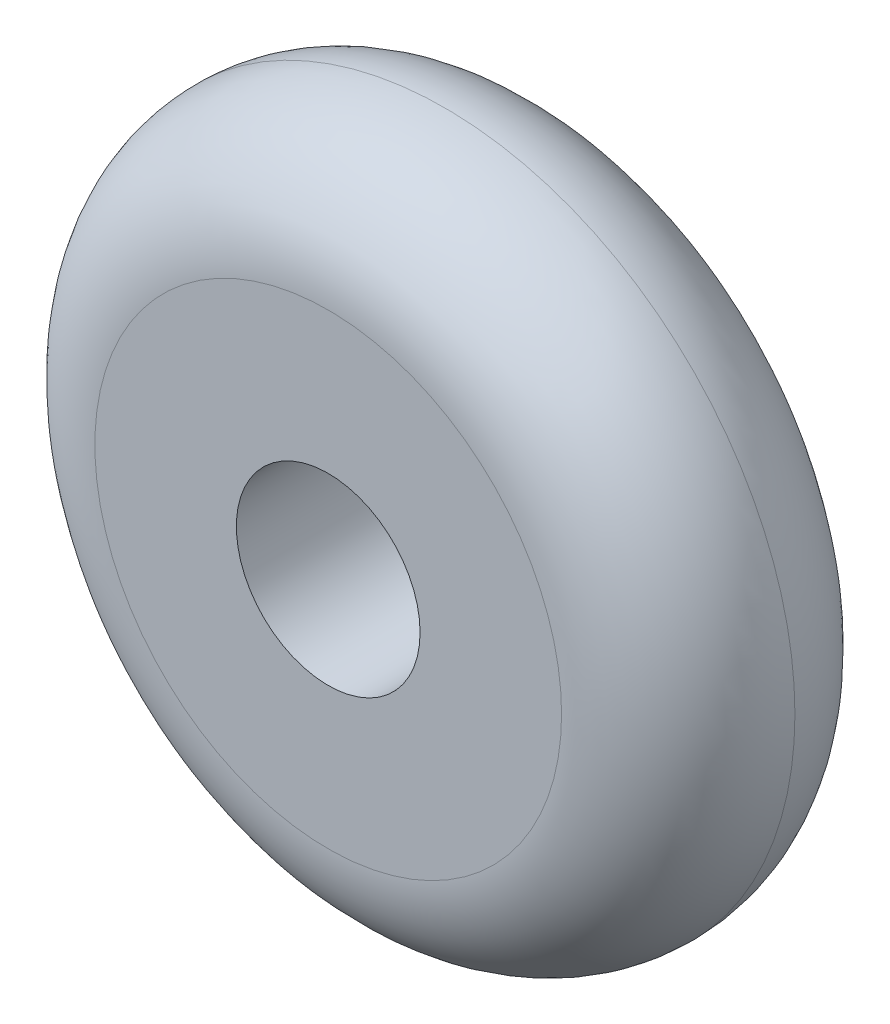
ISO-10303-21;
HEADER;
FILE_DESCRIPTION(('STEP AP214'),'2;1');
FILE_NAME('part.step','',(''),(''),'','','');
FILE_SCHEMA(('AUTOMOTIVE_DESIGN { 1 0 10303 214 1 1 1 1 }'));
ENDSEC;
DATA;
#1=APPLICATION_CONTEXT('core data for automotive mechanical design processes');
#2=APPLICATION_PROTOCOL_DEFINITION('international standard','automotive_design',2000,#1);
#3=PRODUCT_CONTEXT('',#1,'mechanical');
#4=PRODUCT('Part','Part','',(#3));
#5=PRODUCT_RELATED_PRODUCT_CATEGORY('part','',(#4));
#6=PRODUCT_DEFINITION_FORMATION('','',#4);
#7=PRODUCT_DEFINITION_CONTEXT('part definition',#1,'design');
#8=PRODUCT_DEFINITION('design','',#6,#7);
#9=PRODUCT_DEFINITION_SHAPE('','',#8);
#10=(LENGTH_UNIT() NAMED_UNIT(*) SI_UNIT(.MILLI.,.METRE.));
#11=(NAMED_UNIT(*) PLANE_ANGLE_UNIT() SI_UNIT($,.RADIAN.));
#12=(NAMED_UNIT(*) SI_UNIT($,.STERADIAN.) SOLID_ANGLE_UNIT());
#13=UNCERTAINTY_MEASURE_WITH_UNIT(LENGTH_MEASURE(1.E-05),#10,'distance_accuracy_value','');
#14=(GEOMETRIC_REPRESENTATION_CONTEXT(3) GLOBAL_UNCERTAINTY_ASSIGNED_CONTEXT((#13)) GLOBAL_UNIT_ASSIGNED_CONTEXT((#10,
#11,#12)) REPRESENTATION_CONTEXT('',''));
#15=CARTESIAN_POINT('',(0.,0.,0.));
#16=DIRECTION('',(0.,0.,1.));
#17=DIRECTION('',(1.,0.,0.));
#18=AXIS2_PLACEMENT_3D('',#15,#16,#17);
#19=CARTESIAN_POINT('',(0.,0.,12.7));
#20=DIRECTION('',(0.,0.,1.));
#21=DIRECTION('',(1.,0.,0.));
#22=AXIS2_PLACEMENT_3D('',#19,#20,#21);
#23=PLANE('',#22);
#24=CARTESIAN_POINT('',(0.,0.,12.7));
#25=DIRECTION('',(0.,0.,1.));
#26=DIRECTION('',(1.,0.,0.));
#27=AXIS2_PLACEMENT_3D('',#24,#25,#26);
#28=CIRCLE('',#27,9.999999939);
#29=CARTESIAN_POINT('',(9.999999939,0.,12.7));
#30=VERTEX_POINT('',#29);
#31=EDGE_CURVE('E44',#30,#30,#28,.T.);
#32=ORIENTED_EDGE('',*,*,#31,.F.);
#33=EDGE_LOOP('',(#32));
#34=FACE_BOUND('',#33,.T.);
#35=CARTESIAN_POINT('',(0.,0.,12.7));
#36=DIRECTION('',(0.,0.,1.));
#37=DIRECTION('',(1.,0.,0.));
#38=AXIS2_PLACEMENT_3D('',#35,#36,#37);
#39=CIRCLE('',#38,25.4);
#40=CARTESIAN_POINT('',(25.4,0.,12.7));
#41=VERTEX_POINT('',#40);
#42=EDGE_CURVE('E10',#41,#41,#39,.T.);
#43=ORIENTED_EDGE('',*,*,#42,.T.);
#44=EDGE_LOOP('',(#43));
#45=FACE_BOUND('',#44,.T.);
#46=ADVANCED_FACE('F30',(#34,#45),#23,.T.);
#47=CARTESIAN_POINT('',(0.,0.,-12.7));
#48=DIRECTION('',(0.,0.,1.));
#49=DIRECTION('',(1.,0.,0.));
#50=AXIS2_PLACEMENT_3D('',#47,#48,#49);
#51=PLANE('',#50);
#52=CARTESIAN_POINT('',(0.,0.,-12.7));
#53=DIRECTION('',(0.,0.,1.));
#54=DIRECTION('',(1.,0.,0.));
#55=AXIS2_PLACEMENT_3D('',#52,#53,#54);
#56=CIRCLE('',#55,9.999999939);
#57=CARTESIAN_POINT('',(9.999999939,0.,-12.7));
#58=VERTEX_POINT('',#57);
#59=EDGE_CURVE('E47',#58,#58,#56,.T.);
#60=ORIENTED_EDGE('',*,*,#59,.T.);
#61=EDGE_LOOP('',(#60));
#62=FACE_BOUND('',#61,.T.);
#63=CARTESIAN_POINT('',(0.,0.,-12.7));
#64=DIRECTION('',(0.,0.,1.));
#65=DIRECTION('',(1.,0.,0.));
#66=AXIS2_PLACEMENT_3D('',#63,#64,#65);
#67=CIRCLE('',#66,25.4);
#68=CARTESIAN_POINT('',(25.4,0.,-12.7));
#69=VERTEX_POINT('',#68);
#70=EDGE_CURVE('E38',#69,#69,#67,.F.);
#71=ORIENTED_EDGE('',*,*,#70,.T.);
#72=EDGE_LOOP('',(#71));
#73=FACE_BOUND('',#72,.T.);
#74=ADVANCED_FACE('F51',(#62,#73),#51,.F.);
#75=CARTESIAN_POINT('',(0.,0.,0.));
#76=DIRECTION('',(0.,0.,1.));
#77=DIRECTION('',(1.,0.,0.));
#78=AXIS2_PLACEMENT_3D('',#75,#76,#77);
#79=TOROIDAL_SURFACE('',#78,25.4,12.7);
#80=ORIENTED_EDGE('',*,*,#42,.F.);
#81=EDGE_LOOP('',(#80));
#82=FACE_BOUND('',#81,.T.);
#83=CARTESIAN_POINT('',(0.,0.,0.));
#84=DIRECTION('',(0.,0.,1.));
#85=DIRECTION('',(1.,0.,0.));
#86=AXIS2_PLACEMENT_3D('',#83,#84,#85);
#87=CIRCLE('',#86,38.1);
#88=CARTESIAN_POINT('',(38.1,0.,0.));
#89=VERTEX_POINT('',#88);
#90=EDGE_CURVE('E34',#89,#89,#87,.F.);
#91=ORIENTED_EDGE('',*,*,#90,.F.);
#92=EDGE_LOOP('',(#91));
#93=FACE_BOUND('',#92,.T.);
#94=ADVANCED_FACE('F32',(#82,#93),#79,.T.);
#95=CARTESIAN_POINT('',(0.,0.,0.));
#96=DIRECTION('',(0.,0.,1.));
#97=DIRECTION('',(1.,0.,0.));
#98=AXIS2_PLACEMENT_3D('',#95,#96,#97);
#99=TOROIDAL_SURFACE('',#98,25.4,12.7);
#100=ORIENTED_EDGE('',*,*,#70,.F.);
#101=EDGE_LOOP('',(#100));
#102=FACE_BOUND('',#101,.T.);
#103=ORIENTED_EDGE('',*,*,#90,.T.);
#104=EDGE_LOOP('',(#103));
#105=FACE_BOUND('',#104,.T.);
#106=ADVANCED_FACE('F56',(#102,#105),#99,.T.);
#107=CARTESIAN_POINT('',(0.,0.,-12.7));
#108=DIRECTION('',(0.,0.,1.));
#109=DIRECTION('',(1.,0.,0.));
#110=AXIS2_PLACEMENT_3D('',#107,#108,#109);
#111=CYLINDRICAL_SURFACE('',#110,9.999999939);
#112=ORIENTED_EDGE('',*,*,#31,.T.);
#113=EDGE_LOOP('',(#112));
#114=FACE_BOUND('',#113,.T.);
#115=ORIENTED_EDGE('',*,*,#59,.F.);
#116=EDGE_LOOP('',(#115));
#117=FACE_BOUND('',#116,.T.);
#118=ADVANCED_FACE('F54',(#114,#117),#111,.F.);
#119=CLOSED_SHELL('',(#46,#74,#94,#106,#118));
#120=MANIFOLD_SOLID_BREP('B2',#119);
#121=ADVANCED_BREP_SHAPE_REPRESENTATION('',(#18,#120),#14);
#122=SHAPE_DEFINITION_REPRESENTATION(#9,#121);
ENDSEC;
END-ISO-10303-21;
